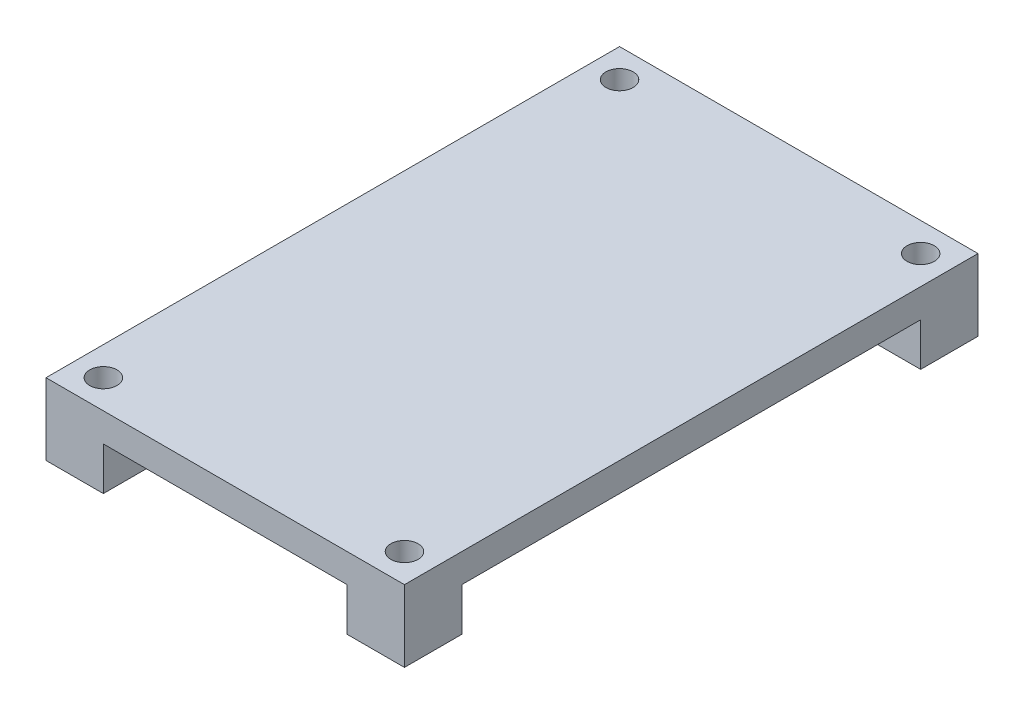
ISO-10303-21;
HEADER;
FILE_DESCRIPTION(('STEP AP214'),'2;1');
FILE_NAME('part.step','',(''),(''),'','','');
FILE_SCHEMA(('AUTOMOTIVE_DESIGN { 1 0 10303 214 1 1 1 1 }'));
ENDSEC;
DATA;
#1=APPLICATION_CONTEXT('core data for automotive mechanical design processes');
#2=APPLICATION_PROTOCOL_DEFINITION('international standard','automotive_design',2000,#1);
#3=PRODUCT_CONTEXT('',#1,'mechanical');
#4=PRODUCT('Part','Part','',(#3));
#5=PRODUCT_RELATED_PRODUCT_CATEGORY('part','',(#4));
#6=PRODUCT_DEFINITION_FORMATION('','',#4);
#7=PRODUCT_DEFINITION_CONTEXT('part definition',#1,'design');
#8=PRODUCT_DEFINITION('design','',#6,#7);
#9=PRODUCT_DEFINITION_SHAPE('','',#8);
#10=(LENGTH_UNIT() NAMED_UNIT(*) SI_UNIT(.MILLI.,.METRE.));
#11=(NAMED_UNIT(*) PLANE_ANGLE_UNIT() SI_UNIT($,.RADIAN.));
#12=(NAMED_UNIT(*) SI_UNIT($,.STERADIAN.) SOLID_ANGLE_UNIT());
#13=UNCERTAINTY_MEASURE_WITH_UNIT(LENGTH_MEASURE(1.E-05),#10,'distance_accuracy_value','');
#14=(GEOMETRIC_REPRESENTATION_CONTEXT(3) GLOBAL_UNCERTAINTY_ASSIGNED_CONTEXT((#13)) GLOBAL_UNIT_ASSIGNED_CONTEXT((#10,
#11,#12)) REPRESENTATION_CONTEXT('',''));
#15=CARTESIAN_POINT('',(0.,0.,0.));
#16=DIRECTION('',(0.,0.,1.));
#17=DIRECTION('',(1.,0.,0.));
#18=AXIS2_PLACEMENT_3D('',#15,#16,#17);
#19=CARTESIAN_POINT('',(0.,0.,0.));
#20=DIRECTION('',(0.,1.,0.));
#21=DIRECTION('',(0.,0.,1.));
#22=AXIS2_PLACEMENT_3D('',#19,#20,#21);
#23=PLANE('',#22);
#24=DIRECTION('',(1.,0.,0.));
#25=VECTOR('',#24,1.);
#26=CARTESIAN_POINT('',(-12.5,0.,16.));
#27=LINE('',#26,#25);
#28=CARTESIAN_POINT('',(-12.5,0.,16.));
#29=VERTEX_POINT('',#28);
#30=CARTESIAN_POINT('',(-8.5,0.,16.));
#31=VERTEX_POINT('',#30);
#32=EDGE_CURVE('E167',#29,#31,#27,.T.);
#33=ORIENTED_EDGE('',*,*,#32,.F.);
#34=DIRECTION('',(0.,0.,1.));
#35=VECTOR('',#34,1.);
#36=CARTESIAN_POINT('',(-12.5,0.,-20.));
#37=LINE('',#36,#35);
#38=CARTESIAN_POINT('',(-12.5,0.,-16.));
#39=VERTEX_POINT('',#38);
#40=EDGE_CURVE('E267',#39,#29,#37,.T.);
#41=ORIENTED_EDGE('',*,*,#40,.F.);
#42=DIRECTION('',(-1.,0.,0.));
#43=VECTOR('',#42,1.);
#44=CARTESIAN_POINT('',(-12.5,0.,-16.));
#45=LINE('',#44,#43);
#46=CARTESIAN_POINT('',(-8.5,0.,-16.));
#47=VERTEX_POINT('',#46);
#48=EDGE_CURVE('E211',#47,#39,#45,.T.);
#49=ORIENTED_EDGE('',*,*,#48,.F.);
#50=DIRECTION('',(0.,0.,1.));
#51=VECTOR('',#50,1.);
#52=CARTESIAN_POINT('',(-8.5,0.,-20.));
#53=LINE('',#52,#51);
#54=CARTESIAN_POINT('',(-8.5,0.,-20.));
#55=VERTEX_POINT('',#54);
#56=EDGE_CURVE('E206',#55,#47,#53,.T.);
#57=ORIENTED_EDGE('',*,*,#56,.F.);
#58=DIRECTION('',(-1.,0.,0.));
#59=VECTOR('',#58,1.);
#60=CARTESIAN_POINT('',(-12.5,0.,-20.));
#61=LINE('',#60,#59);
#62=CARTESIAN_POINT('',(8.5,0.,-20.));
#63=VERTEX_POINT('',#62);
#64=EDGE_CURVE('E270',#63,#55,#61,.T.);
#65=ORIENTED_EDGE('',*,*,#64,.F.);
#66=DIRECTION('',(0.,0.,-1.));
#67=VECTOR('',#66,1.);
#68=CARTESIAN_POINT('',(8.5,0.,-20.));
#69=LINE('',#68,#67);
#70=CARTESIAN_POINT('',(8.5,0.,-16.));
#71=VERTEX_POINT('',#70);
#72=EDGE_CURVE('E235',#71,#63,#69,.T.);
#73=ORIENTED_EDGE('',*,*,#72,.F.);
#74=DIRECTION('',(-1.,0.,0.));
#75=VECTOR('',#74,1.);
#76=CARTESIAN_POINT('',(12.5,0.,-16.));
#77=LINE('',#76,#75);
#78=CARTESIAN_POINT('',(12.5,0.,-16.));
#79=VERTEX_POINT('',#78);
#80=EDGE_CURVE('E230',#79,#71,#77,.T.);
#81=ORIENTED_EDGE('',*,*,#80,.F.);
#82=DIRECTION('',(0.,0.,-1.));
#83=VECTOR('',#82,1.);
#84=CARTESIAN_POINT('',(12.5,0.,-20.));
#85=LINE('',#84,#83);
#86=CARTESIAN_POINT('',(12.5,0.,16.));
#87=VERTEX_POINT('',#86);
#88=EDGE_CURVE('E280',#87,#79,#85,.T.);
#89=ORIENTED_EDGE('',*,*,#88,.F.);
#90=DIRECTION('',(1.,0.,0.));
#91=VECTOR('',#90,1.);
#92=CARTESIAN_POINT('',(12.5,0.,16.));
#93=LINE('',#92,#91);
#94=CARTESIAN_POINT('',(8.49999999999999,0.,16.));
#95=VERTEX_POINT('',#94);
#96=EDGE_CURVE('E188',#95,#87,#93,.T.);
#97=ORIENTED_EDGE('',*,*,#96,.F.);
#98=DIRECTION('',(0.,0.,-1.));
#99=VECTOR('',#98,1.);
#100=CARTESIAN_POINT('',(8.49999999999999,0.,20.));
#101=LINE('',#100,#99);
#102=CARTESIAN_POINT('',(8.49999999999999,0.,20.));
#103=VERTEX_POINT('',#102);
#104=EDGE_CURVE('E183',#103,#95,#101,.T.);
#105=ORIENTED_EDGE('',*,*,#104,.F.);
#106=DIRECTION('',(1.,0.,0.));
#107=VECTOR('',#106,1.);
#108=CARTESIAN_POINT('',(-12.5,0.,20.));
#109=LINE('',#108,#107);
#110=CARTESIAN_POINT('',(-8.5,0.,20.));
#111=VERTEX_POINT('',#110);
#112=EDGE_CURVE('E278',#111,#103,#109,.T.);
#113=ORIENTED_EDGE('',*,*,#112,.F.);
#114=DIRECTION('',(0.,0.,1.));
#115=VECTOR('',#114,1.);
#116=CARTESIAN_POINT('',(-8.5,0.,20.));
#117=LINE('',#116,#115);
#118=EDGE_CURVE('E165',#31,#111,#117,.T.);
#119=ORIENTED_EDGE('',*,*,#118,.F.);
#120=EDGE_LOOP('',(#33,#41,#49,#57,#65,#73,#81,#89,#97,#105,#113,#119));
#121=FACE_BOUND('',#120,.T.);
#122=ADVANCED_FACE('F32',(#121),#23,.F.);
#123=CARTESIAN_POINT('',(0.,2.,0.));
#124=DIRECTION('',(0.,1.,0.));
#125=DIRECTION('',(0.,0.,1.));
#126=AXIS2_PLACEMENT_3D('',#123,#124,#125);
#127=PLANE('',#126);
#128=CARTESIAN_POINT('',(-10.5,2.,18.));
#129=DIRECTION('',(0.,1.,0.));
#130=DIRECTION('',(0.,0.,-1.));
#131=AXIS2_PLACEMENT_3D('',#128,#129,#130);
#132=CIRCLE('',#131,0.949999999999999);
#133=CARTESIAN_POINT('',(-10.5,2.,17.05));
#134=VERTEX_POINT('',#133);
#135=EDGE_CURVE('E258',#134,#134,#132,.T.);
#136=ORIENTED_EDGE('',*,*,#135,.F.);
#137=EDGE_LOOP('',(#136));
#138=FACE_BOUND('',#137,.T.);
#139=CARTESIAN_POINT('',(-10.5,2.,-18.));
#140=DIRECTION('',(0.,1.,0.));
#141=DIRECTION('',(0.,0.,1.));
#142=AXIS2_PLACEMENT_3D('',#139,#140,#141);
#143=CIRCLE('',#142,0.949999999999999);
#144=CARTESIAN_POINT('',(-10.5,2.,-17.05));
#145=VERTEX_POINT('',#144);
#146=EDGE_CURVE('E264',#145,#145,#143,.T.);
#147=ORIENTED_EDGE('',*,*,#146,.F.);
#148=EDGE_LOOP('',(#147));
#149=FACE_BOUND('',#148,.T.);
#150=DIRECTION('',(0.,0.,1.));
#151=VECTOR('',#150,1.);
#152=CARTESIAN_POINT('',(-12.5,2.,-20.));
#153=LINE('',#152,#151);
#154=CARTESIAN_POINT('',(-12.5,2.,-20.));
#155=VERTEX_POINT('',#154);
#156=CARTESIAN_POINT('',(-12.5,2.,20.));
#157=VERTEX_POINT('',#156);
#158=EDGE_CURVE('E268',#155,#157,#153,.T.);
#159=ORIENTED_EDGE('',*,*,#158,.T.);
#160=DIRECTION('',(1.,0.,0.));
#161=VECTOR('',#160,1.);
#162=CARTESIAN_POINT('',(-12.5,2.,20.));
#163=LINE('',#162,#161);
#164=CARTESIAN_POINT('',(12.5,2.,20.));
#165=VERTEX_POINT('',#164);
#166=EDGE_CURVE('E149',#157,#165,#163,.T.);
#167=ORIENTED_EDGE('',*,*,#166,.T.);
#168=DIRECTION('',(0.,0.,-1.));
#169=VECTOR('',#168,1.);
#170=CARTESIAN_POINT('',(12.5,2.,-20.));
#171=LINE('',#170,#169);
#172=CARTESIAN_POINT('',(12.5,2.,-20.));
#173=VERTEX_POINT('',#172);
#174=EDGE_CURVE('E272',#165,#173,#171,.T.);
#175=ORIENTED_EDGE('',*,*,#174,.T.);
#176=DIRECTION('',(-1.,0.,0.));
#177=VECTOR('',#176,1.);
#178=CARTESIAN_POINT('',(-12.5,2.,-20.));
#179=LINE('',#178,#177);
#180=EDGE_CURVE('E274',#173,#155,#179,.T.);
#181=ORIENTED_EDGE('',*,*,#180,.T.);
#182=EDGE_LOOP('',(#159,#167,#175,#181));
#183=FACE_BOUND('',#182,.T.);
#184=CARTESIAN_POINT('',(10.5,2.,-18.));
#185=DIRECTION('',(0.,1.,0.));
#186=DIRECTION('',(0.,0.,-1.));
#187=AXIS2_PLACEMENT_3D('',#184,#185,#186);
#188=CIRCLE('',#187,0.949999999999999);
#189=CARTESIAN_POINT('',(10.5,2.,-18.95));
#190=VERTEX_POINT('',#189);
#191=EDGE_CURVE('E261',#190,#190,#188,.T.);
#192=ORIENTED_EDGE('',*,*,#191,.F.);
#193=EDGE_LOOP('',(#192));
#194=FACE_BOUND('',#193,.T.);
#195=CARTESIAN_POINT('',(10.5,2.,18.));
#196=DIRECTION('',(0.,1.,0.));
#197=DIRECTION('',(0.,0.,1.));
#198=AXIS2_PLACEMENT_3D('',#195,#196,#197);
#199=CIRCLE('',#198,0.949999999999999);
#200=CARTESIAN_POINT('',(10.5,2.,18.95));
#201=VERTEX_POINT('',#200);
#202=EDGE_CURVE('E255',#201,#201,#199,.T.);
#203=ORIENTED_EDGE('',*,*,#202,.F.);
#204=EDGE_LOOP('',(#203));
#205=FACE_BOUND('',#204,.T.);
#206=ADVANCED_FACE('F322',(#138,#149,#183,#194,#205),#127,.T.);
#207=CARTESIAN_POINT('',(-12.5,2.,-20.));
#208=DIRECTION('',(1.,0.,0.));
#209=DIRECTION('',(0.,0.,-1.));
#210=AXIS2_PLACEMENT_3D('',#207,#208,#209);
#211=PLANE('',#210);
#212=DIRECTION('',(0.,-1.,0.));
#213=VECTOR('',#212,1.);
#214=CARTESIAN_POINT('',(-12.5,2.,-20.));
#215=LINE('',#214,#213);
#216=CARTESIAN_POINT('',(-12.5,-3.,-20.));
#217=VERTEX_POINT('',#216);
#218=EDGE_CURVE('E276',#155,#217,#215,.T.);
#219=ORIENTED_EDGE('',*,*,#218,.T.);
#220=DIRECTION('',(0.,0.,-1.));
#221=VECTOR('',#220,1.);
#222=CARTESIAN_POINT('',(-12.5,-3.,-20.));
#223=LINE('',#222,#221);
#224=CARTESIAN_POINT('',(-12.5,-3.,-16.));
#225=VERTEX_POINT('',#224);
#226=EDGE_CURVE('E207',#225,#217,#223,.T.);
#227=ORIENTED_EDGE('',*,*,#226,.F.);
#228=DIRECTION('',(0.,1.,0.));
#229=VECTOR('',#228,1.);
#230=CARTESIAN_POINT('',(-12.5,-3.,-16.));
#231=LINE('',#230,#229);
#232=EDGE_CURVE('E217',#225,#39,#231,.T.);
#233=ORIENTED_EDGE('',*,*,#232,.T.);
#234=ORIENTED_EDGE('',*,*,#40,.T.);
#235=DIRECTION('',(0.,1.,0.));
#236=VECTOR('',#235,1.);
#237=CARTESIAN_POINT('',(-12.5,-3.,16.));
#238=LINE('',#237,#236);
#239=CARTESIAN_POINT('',(-12.5,-3.,16.));
#240=VERTEX_POINT('',#239);
#241=EDGE_CURVE('E156',#240,#29,#238,.T.);
#242=ORIENTED_EDGE('',*,*,#241,.F.);
#243=DIRECTION('',(0.,0.,-1.));
#244=VECTOR('',#243,1.);
#245=CARTESIAN_POINT('',(-12.5,-3.,20.));
#246=LINE('',#245,#244);
#247=CARTESIAN_POINT('',(-12.5,-3.,20.));
#248=VERTEX_POINT('',#247);
#249=EDGE_CURVE('E154',#248,#240,#246,.T.);
#250=ORIENTED_EDGE('',*,*,#249,.F.);
#251=DIRECTION('',(0.,-1.,0.));
#252=VECTOR('',#251,1.);
#253=CARTESIAN_POINT('',(-12.5,2.,20.));
#254=LINE('',#253,#252);
#255=EDGE_CURVE('E11',#157,#248,#254,.T.);
#256=ORIENTED_EDGE('',*,*,#255,.F.);
#257=ORIENTED_EDGE('',*,*,#158,.F.);
#258=EDGE_LOOP('',(#219,#227,#233,#234,#242,#250,#256,#257));
#259=FACE_BOUND('',#258,.T.);
#260=ADVANCED_FACE('F34',(#259),#211,.F.);
#261=CARTESIAN_POINT('',(-12.5,2.,20.));
#262=DIRECTION('',(0.,0.,-1.));
#263=DIRECTION('',(-1.,0.,0.));
#264=AXIS2_PLACEMENT_3D('',#261,#262,#263);
#265=PLANE('',#264);
#266=ORIENTED_EDGE('',*,*,#255,.T.);
#267=DIRECTION('',(-1.,0.,0.));
#268=VECTOR('',#267,1.);
#269=CARTESIAN_POINT('',(-12.5,-3.,20.));
#270=LINE('',#269,#268);
#271=CARTESIAN_POINT('',(-8.5,-3.,20.));
#272=VERTEX_POINT('',#271);
#273=EDGE_CURVE('E147',#272,#248,#270,.T.);
#274=ORIENTED_EDGE('',*,*,#273,.F.);
#275=DIRECTION('',(0.,1.,0.));
#276=VECTOR('',#275,1.);
#277=CARTESIAN_POINT('',(-8.5,-3.,20.));
#278=LINE('',#277,#276);
#279=EDGE_CURVE('E47',#272,#111,#278,.T.);
#280=ORIENTED_EDGE('',*,*,#279,.T.);
#281=ORIENTED_EDGE('',*,*,#112,.T.);
#282=DIRECTION('',(0.,1.,0.));
#283=VECTOR('',#282,1.);
#284=CARTESIAN_POINT('',(8.49999999999999,-3.,20.));
#285=LINE('',#284,#283);
#286=CARTESIAN_POINT('',(8.49999999999999,-3.,20.));
#287=VERTEX_POINT('',#286);
#288=EDGE_CURVE('E200',#287,#103,#285,.T.);
#289=ORIENTED_EDGE('',*,*,#288,.F.);
#290=DIRECTION('',(-1.,0.,0.));
#291=VECTOR('',#290,1.);
#292=CARTESIAN_POINT('',(12.5,-3.,20.));
#293=LINE('',#292,#291);
#294=CARTESIAN_POINT('',(12.5,-3.,20.));
#295=VERTEX_POINT('',#294);
#296=EDGE_CURVE('E187',#295,#287,#293,.T.);
#297=ORIENTED_EDGE('',*,*,#296,.F.);
#298=DIRECTION('',(0.,-1.,0.));
#299=VECTOR('',#298,1.);
#300=CARTESIAN_POINT('',(12.5,2.,20.));
#301=LINE('',#300,#299);
#302=EDGE_CURVE('E40',#165,#295,#301,.T.);
#303=ORIENTED_EDGE('',*,*,#302,.F.);
#304=ORIENTED_EDGE('',*,*,#166,.F.);
#305=EDGE_LOOP('',(#266,#274,#280,#281,#289,#297,#303,#304));
#306=FACE_BOUND('',#305,.T.);
#307=ADVANCED_FACE('F145',(#306),#265,.F.);
#308=CARTESIAN_POINT('',(12.5,2.,-20.));
#309=DIRECTION('',(-1.,0.,0.));
#310=DIRECTION('',(0.,0.,1.));
#311=AXIS2_PLACEMENT_3D('',#308,#309,#310);
#312=PLANE('',#311);
#313=ORIENTED_EDGE('',*,*,#302,.T.);
#314=DIRECTION('',(0.,0.,1.));
#315=VECTOR('',#314,1.);
#316=CARTESIAN_POINT('',(12.5,-3.,20.));
#317=LINE('',#316,#315);
#318=CARTESIAN_POINT('',(12.5,-3.,16.));
#319=VERTEX_POINT('',#318);
#320=EDGE_CURVE('E184',#319,#295,#317,.T.);
#321=ORIENTED_EDGE('',*,*,#320,.F.);
#322=DIRECTION('',(0.,1.,0.));
#323=VECTOR('',#322,1.);
#324=CARTESIAN_POINT('',(12.5,-3.,16.));
#325=LINE('',#324,#323);
#326=EDGE_CURVE('E55',#319,#87,#325,.T.);
#327=ORIENTED_EDGE('',*,*,#326,.T.);
#328=ORIENTED_EDGE('',*,*,#88,.T.);
#329=DIRECTION('',(0.,1.,0.));
#330=VECTOR('',#329,1.);
#331=CARTESIAN_POINT('',(12.5,-3.,-16.));
#332=LINE('',#331,#330);
#333=CARTESIAN_POINT('',(12.5,-3.,-16.));
#334=VERTEX_POINT('',#333);
#335=EDGE_CURVE('E252',#334,#79,#332,.T.);
#336=ORIENTED_EDGE('',*,*,#335,.F.);
#337=DIRECTION('',(0.,0.,1.));
#338=VECTOR('',#337,1.);
#339=CARTESIAN_POINT('',(12.5,-3.,-20.));
#340=LINE('',#339,#338);
#341=CARTESIAN_POINT('',(12.5,-3.,-20.));
#342=VERTEX_POINT('',#341);
#343=EDGE_CURVE('E231',#342,#334,#340,.T.);
#344=ORIENTED_EDGE('',*,*,#343,.F.);
#345=DIRECTION('',(0.,-1.,0.));
#346=VECTOR('',#345,1.);
#347=CARTESIAN_POINT('',(12.5,2.,-20.));
#348=LINE('',#347,#346);
#349=EDGE_CURVE('E285',#173,#342,#348,.T.);
#350=ORIENTED_EDGE('',*,*,#349,.F.);
#351=ORIENTED_EDGE('',*,*,#174,.F.);
#352=EDGE_LOOP('',(#313,#321,#327,#328,#336,#344,#350,#351));
#353=FACE_BOUND('',#352,.T.);
#354=ADVANCED_FACE('F288',(#353),#312,.F.);
#355=CARTESIAN_POINT('',(-12.5,2.,-20.));
#356=DIRECTION('',(0.,0.,1.));
#357=DIRECTION('',(1.,0.,0.));
#358=AXIS2_PLACEMENT_3D('',#355,#356,#357);
#359=PLANE('',#358);
#360=ORIENTED_EDGE('',*,*,#349,.T.);
#361=DIRECTION('',(1.,0.,0.));
#362=VECTOR('',#361,1.);
#363=CARTESIAN_POINT('',(12.5,-3.,-20.));
#364=LINE('',#363,#362);
#365=CARTESIAN_POINT('',(8.5,-3.,-20.));
#366=VERTEX_POINT('',#365);
#367=EDGE_CURVE('E239',#366,#342,#364,.T.);
#368=ORIENTED_EDGE('',*,*,#367,.F.);
#369=DIRECTION('',(0.,1.,0.));
#370=VECTOR('',#369,1.);
#371=CARTESIAN_POINT('',(8.5,-3.,-20.));
#372=LINE('',#371,#370);
#373=EDGE_CURVE('E242',#366,#63,#372,.T.);
#374=ORIENTED_EDGE('',*,*,#373,.T.);
#375=ORIENTED_EDGE('',*,*,#64,.T.);
#376=DIRECTION('',(0.,1.,0.));
#377=VECTOR('',#376,1.);
#378=CARTESIAN_POINT('',(-8.5,-3.,-20.));
#379=LINE('',#378,#377);
#380=CARTESIAN_POINT('',(-8.5,-3.,-20.));
#381=VERTEX_POINT('',#380);
#382=EDGE_CURVE('E225',#381,#55,#379,.T.);
#383=ORIENTED_EDGE('',*,*,#382,.F.);
#384=DIRECTION('',(1.,0.,0.));
#385=VECTOR('',#384,1.);
#386=CARTESIAN_POINT('',(-12.5,-3.,-20.));
#387=LINE('',#386,#385);
#388=EDGE_CURVE('E210',#217,#381,#387,.T.);
#389=ORIENTED_EDGE('',*,*,#388,.F.);
#390=ORIENTED_EDGE('',*,*,#218,.F.);
#391=ORIENTED_EDGE('',*,*,#180,.F.);
#392=EDGE_LOOP('',(#360,#368,#374,#375,#383,#389,#390,#391));
#393=FACE_BOUND('',#392,.T.);
#394=ADVANCED_FACE('F317',(#393),#359,.F.);
#395=CARTESIAN_POINT('',(-10.5,2.,-18.));
#396=DIRECTION('',(0.,-1.,0.));
#397=DIRECTION('',(0.,0.,-1.));
#398=AXIS2_PLACEMENT_3D('',#395,#396,#397);
#399=CYLINDRICAL_SURFACE('',#398,0.949999999999999);
#400=ORIENTED_EDGE('',*,*,#146,.T.);
#401=EDGE_LOOP('',(#400));
#402=FACE_BOUND('',#401,.T.);
#403=CARTESIAN_POINT('',(-10.5,-3.,-18.));
#404=DIRECTION('',(0.,-1.,0.));
#405=DIRECTION('',(0.,0.,1.));
#406=AXIS2_PLACEMENT_3D('',#403,#404,#405);
#407=CIRCLE('',#406,0.949999999999999);
#408=CARTESIAN_POINT('',(-10.5,-3.,-17.05));
#409=VERTEX_POINT('',#408);
#410=EDGE_CURVE('E203',#409,#409,#407,.T.);
#411=ORIENTED_EDGE('',*,*,#410,.T.);
#412=EDGE_LOOP('',(#411));
#413=FACE_BOUND('',#412,.T.);
#414=ADVANCED_FACE('F367',(#402,#413),#399,.F.);
#415=CARTESIAN_POINT('',(10.5,2.,-18.));
#416=DIRECTION('',(0.,-1.,0.));
#417=DIRECTION('',(0.,0.,-1.));
#418=AXIS2_PLACEMENT_3D('',#415,#416,#417);
#419=CYLINDRICAL_SURFACE('',#418,0.949999999999999);
#420=ORIENTED_EDGE('',*,*,#191,.T.);
#421=EDGE_LOOP('',(#420));
#422=FACE_BOUND('',#421,.T.);
#423=CARTESIAN_POINT('',(10.5,-3.,-18.));
#424=DIRECTION('',(0.,-1.,0.));
#425=DIRECTION('',(0.,0.,-1.));
#426=AXIS2_PLACEMENT_3D('',#423,#424,#425);
#427=CIRCLE('',#426,0.949999999999999);
#428=CARTESIAN_POINT('',(10.5,-3.,-18.95));
#429=VERTEX_POINT('',#428);
#430=EDGE_CURVE('E227',#429,#429,#427,.T.);
#431=ORIENTED_EDGE('',*,*,#430,.T.);
#432=EDGE_LOOP('',(#431));
#433=FACE_BOUND('',#432,.T.);
#434=ADVANCED_FACE('F440',(#422,#433),#419,.F.);
#435=CARTESIAN_POINT('',(-10.5,2.,18.));
#436=DIRECTION('',(0.,-1.,0.));
#437=DIRECTION('',(0.,0.,-1.));
#438=AXIS2_PLACEMENT_3D('',#435,#436,#437);
#439=CYLINDRICAL_SURFACE('',#438,0.949999999999999);
#440=ORIENTED_EDGE('',*,*,#135,.T.);
#441=EDGE_LOOP('',(#440));
#442=FACE_BOUND('',#441,.T.);
#443=CARTESIAN_POINT('',(-10.5,-3.,18.));
#444=DIRECTION('',(0.,-1.,0.));
#445=DIRECTION('',(0.,0.,-1.));
#446=AXIS2_PLACEMENT_3D('',#443,#444,#445);
#447=CIRCLE('',#446,0.949999999999999);
#448=CARTESIAN_POINT('',(-10.5,-3.,17.05));
#449=VERTEX_POINT('',#448);
#450=EDGE_CURVE('E170',#449,#449,#447,.T.);
#451=ORIENTED_EDGE('',*,*,#450,.T.);
#452=EDGE_LOOP('',(#451));
#453=FACE_BOUND('',#452,.T.);
#454=ADVANCED_FACE('F451',(#442,#453),#439,.F.);
#455=CARTESIAN_POINT('',(10.5,2.,18.));
#456=DIRECTION('',(0.,-1.,0.));
#457=DIRECTION('',(0.,0.,-1.));
#458=AXIS2_PLACEMENT_3D('',#455,#456,#457);
#459=CYLINDRICAL_SURFACE('',#458,0.949999999999999);
#460=ORIENTED_EDGE('',*,*,#202,.T.);
#461=EDGE_LOOP('',(#460));
#462=FACE_BOUND('',#461,.T.);
#463=CARTESIAN_POINT('',(10.5,-3.,18.));
#464=DIRECTION('',(0.,-1.,0.));
#465=DIRECTION('',(0.,0.,1.));
#466=AXIS2_PLACEMENT_3D('',#463,#464,#465);
#467=CIRCLE('',#466,0.949999999999999);
#468=CARTESIAN_POINT('',(10.5,-3.,18.95));
#469=VERTEX_POINT('',#468);
#470=EDGE_CURVE('E180',#469,#469,#467,.T.);
#471=ORIENTED_EDGE('',*,*,#470,.T.);
#472=EDGE_LOOP('',(#471));
#473=FACE_BOUND('',#472,.T.);
#474=ADVANCED_FACE('F390',(#462,#473),#459,.F.);
#475=CARTESIAN_POINT('',(0.,-3.,0.));
#476=DIRECTION('',(0.,-1.,0.));
#477=DIRECTION('',(0.,0.,-1.));
#478=AXIS2_PLACEMENT_3D('',#475,#476,#477);
#479=PLANE('',#478);
#480=ORIENTED_EDGE('',*,*,#343,.T.);
#481=DIRECTION('',(-1.,0.,0.));
#482=VECTOR('',#481,1.);
#483=CARTESIAN_POINT('',(12.5,-3.,-16.));
#484=LINE('',#483,#482);
#485=CARTESIAN_POINT('',(8.5,-3.,-16.));
#486=VERTEX_POINT('',#485);
#487=EDGE_CURVE('E234',#334,#486,#484,.T.);
#488=ORIENTED_EDGE('',*,*,#487,.T.);
#489=DIRECTION('',(0.,0.,-1.));
#490=VECTOR('',#489,1.);
#491=CARTESIAN_POINT('',(8.5,-3.,-20.));
#492=LINE('',#491,#490);
#493=EDGE_CURVE('E237',#486,#366,#492,.T.);
#494=ORIENTED_EDGE('',*,*,#493,.T.);
#495=ORIENTED_EDGE('',*,*,#367,.T.);
#496=EDGE_LOOP('',(#480,#488,#494,#495));
#497=FACE_BOUND('',#496,.T.);
#498=ORIENTED_EDGE('',*,*,#430,.F.);
#499=EDGE_LOOP('',(#498));
#500=FACE_BOUND('',#499,.T.);
#501=ADVANCED_FACE('F312',(#497,#500),#479,.T.);
#502=CARTESIAN_POINT('',(12.5,-3.,-16.));
#503=DIRECTION('',(0.,0.,-1.));
#504=DIRECTION('',(-1.,0.,0.));
#505=AXIS2_PLACEMENT_3D('',#502,#503,#504);
#506=PLANE('',#505);
#507=ORIENTED_EDGE('',*,*,#80,.T.);
#508=DIRECTION('',(0.,1.,0.));
#509=VECTOR('',#508,1.);
#510=CARTESIAN_POINT('',(8.5,-3.,-16.));
#511=LINE('',#510,#509);
#512=EDGE_CURVE('E249',#486,#71,#511,.T.);
#513=ORIENTED_EDGE('',*,*,#512,.F.);
#514=ORIENTED_EDGE('',*,*,#487,.F.);
#515=ORIENTED_EDGE('',*,*,#335,.T.);
#516=EDGE_LOOP('',(#507,#513,#514,#515));
#517=FACE_BOUND('',#516,.T.);
#518=ADVANCED_FACE('F308',(#517),#506,.F.);
#519=CARTESIAN_POINT('',(8.5,-3.,-20.));
#520=DIRECTION('',(1.,0.,0.));
#521=DIRECTION('',(0.,0.,-1.));
#522=AXIS2_PLACEMENT_3D('',#519,#520,#521);
#523=PLANE('',#522);
#524=ORIENTED_EDGE('',*,*,#72,.T.);
#525=ORIENTED_EDGE('',*,*,#373,.F.);
#526=ORIENTED_EDGE('',*,*,#493,.F.);
#527=ORIENTED_EDGE('',*,*,#512,.T.);
#528=EDGE_LOOP('',(#524,#525,#526,#527));
#529=FACE_BOUND('',#528,.T.);
#530=ADVANCED_FACE('F486',(#529),#523,.F.);
#531=CARTESIAN_POINT('',(0.,-3.,0.));
#532=DIRECTION('',(0.,1.,0.));
#533=DIRECTION('',(0.,0.,1.));
#534=AXIS2_PLACEMENT_3D('',#531,#532,#533);
#535=PLANE('',#534);
#536=ORIENTED_EDGE('',*,*,#226,.T.);
#537=ORIENTED_EDGE('',*,*,#388,.T.);
#538=DIRECTION('',(0.,0.,1.));
#539=VECTOR('',#538,1.);
#540=CARTESIAN_POINT('',(-8.5,-3.,-20.));
#541=LINE('',#540,#539);
#542=CARTESIAN_POINT('',(-8.5,-3.,-16.));
#543=VERTEX_POINT('',#542);
#544=EDGE_CURVE('E213',#381,#543,#541,.T.);
#545=ORIENTED_EDGE('',*,*,#544,.T.);
#546=DIRECTION('',(-1.,0.,0.));
#547=VECTOR('',#546,1.);
#548=CARTESIAN_POINT('',(-12.5,-3.,-16.));
#549=LINE('',#548,#547);
#550=EDGE_CURVE('E215',#543,#225,#549,.T.);
#551=ORIENTED_EDGE('',*,*,#550,.T.);
#552=EDGE_LOOP('',(#536,#537,#545,#551));
#553=FACE_BOUND('',#552,.T.);
#554=ORIENTED_EDGE('',*,*,#410,.F.);
#555=EDGE_LOOP('',(#554));
#556=FACE_BOUND('',#555,.T.);
#557=ADVANCED_FACE('F328',(#553,#556),#535,.F.);
#558=CARTESIAN_POINT('',(-8.5,-3.,-20.));
#559=DIRECTION('',(-1.,0.,0.));
#560=DIRECTION('',(0.,0.,1.));
#561=AXIS2_PLACEMENT_3D('',#558,#559,#560);
#562=PLANE('',#561);
#563=ORIENTED_EDGE('',*,*,#56,.T.);
#564=DIRECTION('',(0.,1.,0.));
#565=VECTOR('',#564,1.);
#566=CARTESIAN_POINT('',(-8.5,-3.,-16.));
#567=LINE('',#566,#565);
#568=EDGE_CURVE('E222',#543,#47,#567,.T.);
#569=ORIENTED_EDGE('',*,*,#568,.F.);
#570=ORIENTED_EDGE('',*,*,#544,.F.);
#571=ORIENTED_EDGE('',*,*,#382,.T.);
#572=EDGE_LOOP('',(#563,#569,#570,#571));
#573=FACE_BOUND('',#572,.T.);
#574=ADVANCED_FACE('F502',(#573),#562,.F.);
#575=CARTESIAN_POINT('',(-12.5,-3.,-16.));
#576=DIRECTION('',(0.,0.,-1.));
#577=DIRECTION('',(-1.,0.,0.));
#578=AXIS2_PLACEMENT_3D('',#575,#576,#577);
#579=PLANE('',#578);
#580=ORIENTED_EDGE('',*,*,#48,.T.);
#581=ORIENTED_EDGE('',*,*,#232,.F.);
#582=ORIENTED_EDGE('',*,*,#550,.F.);
#583=ORIENTED_EDGE('',*,*,#568,.T.);
#584=EDGE_LOOP('',(#580,#581,#582,#583));
#585=FACE_BOUND('',#584,.T.);
#586=ADVANCED_FACE('F334',(#585),#579,.F.);
#587=CARTESIAN_POINT('',(0.,-3.,0.));
#588=DIRECTION('',(0.,1.,0.));
#589=DIRECTION('',(0.,0.,1.));
#590=AXIS2_PLACEMENT_3D('',#587,#588,#589);
#591=PLANE('',#590);
#592=ORIENTED_EDGE('',*,*,#320,.T.);
#593=ORIENTED_EDGE('',*,*,#296,.T.);
#594=DIRECTION('',(0.,0.,-1.));
#595=VECTOR('',#594,1.);
#596=CARTESIAN_POINT('',(8.49999999999999,-3.,20.));
#597=LINE('',#596,#595);
#598=CARTESIAN_POINT('',(8.49999999999999,-3.,16.));
#599=VERTEX_POINT('',#598);
#600=EDGE_CURVE('E190',#287,#599,#597,.T.);
#601=ORIENTED_EDGE('',*,*,#600,.T.);
#602=DIRECTION('',(1.,0.,0.));
#603=VECTOR('',#602,1.);
#604=CARTESIAN_POINT('',(12.5,-3.,16.));
#605=LINE('',#604,#603);
#606=EDGE_CURVE('E192',#599,#319,#605,.T.);
#607=ORIENTED_EDGE('',*,*,#606,.T.);
#608=EDGE_LOOP('',(#592,#593,#601,#607));
#609=FACE_BOUND('',#608,.T.);
#610=ORIENTED_EDGE('',*,*,#470,.F.);
#611=EDGE_LOOP('',(#610));
#612=FACE_BOUND('',#611,.T.);
#613=ADVANCED_FACE('F293',(#609,#612),#591,.F.);
#614=CARTESIAN_POINT('',(8.49999999999999,-3.,20.));
#615=DIRECTION('',(1.,0.,0.));
#616=DIRECTION('',(0.,0.,-1.));
#617=AXIS2_PLACEMENT_3D('',#614,#615,#616);
#618=PLANE('',#617);
#619=ORIENTED_EDGE('',*,*,#104,.T.);
#620=DIRECTION('',(0.,1.,0.));
#621=VECTOR('',#620,1.);
#622=CARTESIAN_POINT('',(8.49999999999999,-3.,16.));
#623=LINE('',#622,#621);
#624=EDGE_CURVE('E197',#599,#95,#623,.T.);
#625=ORIENTED_EDGE('',*,*,#624,.F.);
#626=ORIENTED_EDGE('',*,*,#600,.F.);
#627=ORIENTED_EDGE('',*,*,#288,.T.);
#628=EDGE_LOOP('',(#619,#625,#626,#627));
#629=FACE_BOUND('',#628,.T.);
#630=ADVANCED_FACE('F346',(#629),#618,.F.);
#631=CARTESIAN_POINT('',(12.5,-3.,16.));
#632=DIRECTION('',(0.,0.,1.));
#633=DIRECTION('',(1.,0.,0.));
#634=AXIS2_PLACEMENT_3D('',#631,#632,#633);
#635=PLANE('',#634);
#636=ORIENTED_EDGE('',*,*,#96,.T.);
#637=ORIENTED_EDGE('',*,*,#326,.F.);
#638=ORIENTED_EDGE('',*,*,#606,.F.);
#639=ORIENTED_EDGE('',*,*,#624,.T.);
#640=EDGE_LOOP('',(#636,#637,#638,#639));
#641=FACE_BOUND('',#640,.T.);
#642=ADVANCED_FACE('F298',(#641),#635,.F.);
#643=CARTESIAN_POINT('',(0.,-3.,0.));
#644=DIRECTION('',(0.,1.,0.));
#645=DIRECTION('',(0.,0.,1.));
#646=AXIS2_PLACEMENT_3D('',#643,#644,#645);
#647=PLANE('',#646);
#648=ORIENTED_EDGE('',*,*,#273,.T.);
#649=ORIENTED_EDGE('',*,*,#249,.T.);
#650=DIRECTION('',(1.,0.,0.));
#651=VECTOR('',#650,1.);
#652=CARTESIAN_POINT('',(-12.5,-3.,16.));
#653=LINE('',#652,#651);
#654=CARTESIAN_POINT('',(-8.5,-3.,16.));
#655=VERTEX_POINT('',#654);
#656=EDGE_CURVE('E159',#240,#655,#653,.T.);
#657=ORIENTED_EDGE('',*,*,#656,.T.);
#658=DIRECTION('',(0.,0.,1.));
#659=VECTOR('',#658,1.);
#660=CARTESIAN_POINT('',(-8.5,-3.,20.));
#661=LINE('',#660,#659);
#662=EDGE_CURVE('E164',#655,#272,#661,.T.);
#663=ORIENTED_EDGE('',*,*,#662,.T.);
#664=EDGE_LOOP('',(#648,#649,#657,#663));
#665=FACE_BOUND('',#664,.T.);
#666=ORIENTED_EDGE('',*,*,#450,.F.);
#667=EDGE_LOOP('',(#666));
#668=FACE_BOUND('',#667,.T.);
#669=ADVANCED_FACE('F161',(#665,#668),#647,.F.);
#670=CARTESIAN_POINT('',(-12.5,-3.,16.));
#671=DIRECTION('',(0.,0.,1.));
#672=DIRECTION('',(1.,0.,0.));
#673=AXIS2_PLACEMENT_3D('',#670,#671,#672);
#674=PLANE('',#673);
#675=ORIENTED_EDGE('',*,*,#32,.T.);
#676=DIRECTION('',(0.,1.,0.));
#677=VECTOR('',#676,1.);
#678=CARTESIAN_POINT('',(-8.5,-3.,16.));
#679=LINE('',#678,#677);
#680=EDGE_CURVE('E176',#655,#31,#679,.T.);
#681=ORIENTED_EDGE('',*,*,#680,.F.);
#682=ORIENTED_EDGE('',*,*,#656,.F.);
#683=ORIENTED_EDGE('',*,*,#241,.T.);
#684=EDGE_LOOP('',(#675,#681,#682,#683));
#685=FACE_BOUND('',#684,.T.);
#686=ADVANCED_FACE('F342',(#685),#674,.F.);
#687=CARTESIAN_POINT('',(-8.5,-3.,20.));
#688=DIRECTION('',(-1.,0.,0.));
#689=DIRECTION('',(0.,0.,1.));
#690=AXIS2_PLACEMENT_3D('',#687,#688,#689);
#691=PLANE('',#690);
#692=ORIENTED_EDGE('',*,*,#118,.T.);
#693=ORIENTED_EDGE('',*,*,#279,.F.);
#694=ORIENTED_EDGE('',*,*,#662,.F.);
#695=ORIENTED_EDGE('',*,*,#680,.T.);
#696=EDGE_LOOP('',(#692,#693,#694,#695));
#697=FACE_BOUND('',#696,.T.);
#698=ADVANCED_FACE('F344',(#697),#691,.F.);
#699=CLOSED_SHELL('',(#122,#206,#260,#307,#354,#394,#414,#434,#454,#474,#501,#518,#530,#557,
#574,#586,#613,#630,#642,#669,#686,#698));
#700=MANIFOLD_SOLID_BREP('B2',#699);
#701=ADVANCED_BREP_SHAPE_REPRESENTATION('',(#18,#700),#14);
#702=SHAPE_DEFINITION_REPRESENTATION(#9,#701);
ENDSEC;
END-ISO-10303-21;
